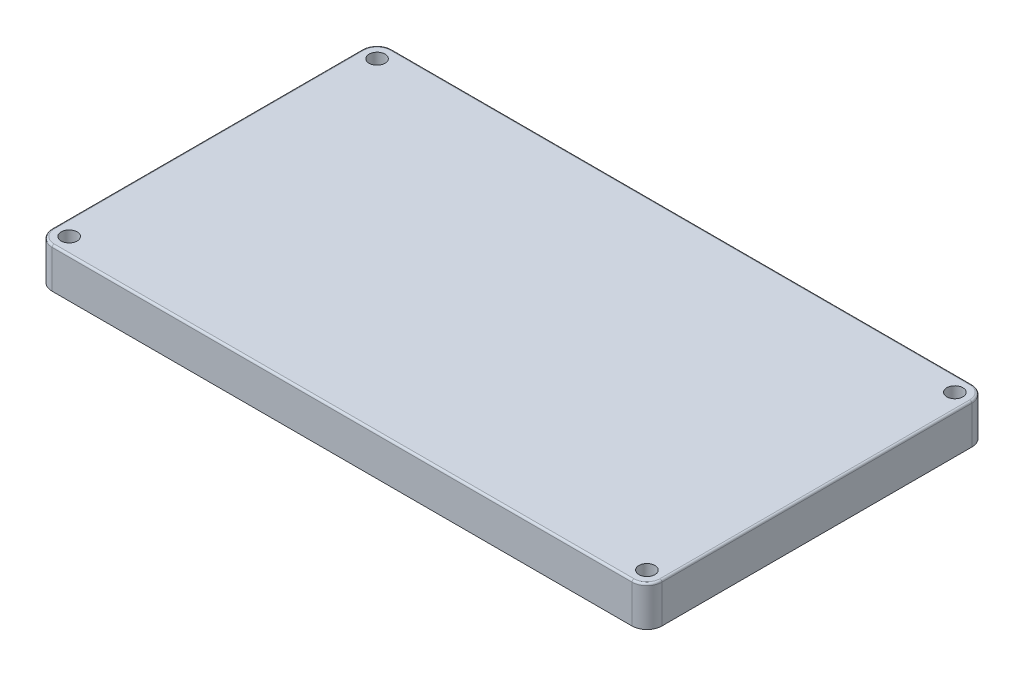
ISO-10303-21;
HEADER;
FILE_DESCRIPTION(('STEP AP214'),'2;1');
FILE_NAME('part.step','',(''),(''),'','','');
FILE_SCHEMA(('AUTOMOTIVE_DESIGN { 1 0 10303 214 1 1 1 1 }'));
ENDSEC;
DATA;
#1=APPLICATION_CONTEXT('core data for automotive mechanical design processes');
#2=APPLICATION_PROTOCOL_DEFINITION('international standard','automotive_design',2000,#1);
#3=PRODUCT_CONTEXT('',#1,'mechanical');
#4=PRODUCT('Part','Part','',(#3));
#5=PRODUCT_RELATED_PRODUCT_CATEGORY('part','',(#4));
#6=PRODUCT_DEFINITION_FORMATION('','',#4);
#7=PRODUCT_DEFINITION_CONTEXT('part definition',#1,'design');
#8=PRODUCT_DEFINITION('design','',#6,#7);
#9=PRODUCT_DEFINITION_SHAPE('','',#8);
#10=(LENGTH_UNIT() NAMED_UNIT(*) SI_UNIT(.MILLI.,.METRE.));
#11=(NAMED_UNIT(*) PLANE_ANGLE_UNIT() SI_UNIT($,.RADIAN.));
#12=(NAMED_UNIT(*) SI_UNIT($,.STERADIAN.) SOLID_ANGLE_UNIT());
#13=UNCERTAINTY_MEASURE_WITH_UNIT(LENGTH_MEASURE(1.E-05),#10,'distance_accuracy_value','');
#14=(GEOMETRIC_REPRESENTATION_CONTEXT(3) GLOBAL_UNCERTAINTY_ASSIGNED_CONTEXT((#13)) GLOBAL_UNIT_ASSIGNED_CONTEXT((#10,
#11,#12)) REPRESENTATION_CONTEXT('',''));
#15=CARTESIAN_POINT('',(0.,0.,0.));
#16=DIRECTION('',(0.,0.,1.));
#17=DIRECTION('',(1.,0.,0.));
#18=AXIS2_PLACEMENT_3D('',#15,#16,#17);
#19=CARTESIAN_POINT('',(152.77525855986,-63.5520685347959,-14.8438253126815));
#20=DIRECTION('',(0.,0.,-1.));
#21=DIRECTION('',(-1.,0.,0.));
#22=AXIS2_PLACEMENT_3D('',#19,#20,#21);
#23=CYLINDRICAL_SURFACE('',#22,1.);
#24=CARTESIAN_POINT('',(152.77525855986,-63.5520685347959,23.9061746873185));
#25=DIRECTION('',(0.,0.,-1.));
#26=DIRECTION('',(1.,0.,0.));
#27=AXIS2_PLACEMENT_3D('',#24,#25,#26);
#28=CIRCLE('',#27,1.);
#29=CARTESIAN_POINT('',(153.77525855986,-63.5520685347959,23.9061746873185));
#30=VERTEX_POINT('',#29);
#31=CARTESIAN_POINT('',(152.77525855986,-62.5520685347959,23.9061746873185));
#32=VERTEX_POINT('',#31);
#33=EDGE_CURVE('E240',#30,#32,#28,.F.);
#34=ORIENTED_EDGE('',*,*,#33,.F.);
#35=DIRECTION('',(0.,0.,-1.));
#36=VECTOR('',#35,1.);
#37=CARTESIAN_POINT('',(153.77525855986,-63.5520685347959,23.9061746873185));
#38=LINE('',#37,#36);
#39=CARTESIAN_POINT('',(153.77525855986,-63.5520685347959,-131.093825312682));
#40=VERTEX_POINT('',#39);
#41=EDGE_CURVE('E210',#40,#30,#38,.F.);
#42=ORIENTED_EDGE('',*,*,#41,.F.);
#43=CARTESIAN_POINT('',(152.77525855986,-63.5520685347959,-131.093825312682));
#44=DIRECTION('',(0.,0.,-1.));
#45=DIRECTION('',(1.,0.,0.));
#46=AXIS2_PLACEMENT_3D('',#43,#44,#45);
#47=CIRCLE('',#46,1.);
#48=CARTESIAN_POINT('',(152.77525855986,-62.5520685347959,-131.093825312682));
#49=VERTEX_POINT('',#48);
#50=EDGE_CURVE('E325',#49,#40,#47,.T.);
#51=ORIENTED_EDGE('',*,*,#50,.F.);
#52=DIRECTION('',(0.,0.,1.));
#53=VECTOR('',#52,1.);
#54=CARTESIAN_POINT('',(152.77525855986,-62.5520685347959,-53.5938253126815));
#55=LINE('',#54,#53);
#56=EDGE_CURVE('E224',#32,#49,#55,.F.);
#57=ORIENTED_EDGE('',*,*,#56,.F.);
#58=EDGE_LOOP('',(#34,#42,#51,#57));
#59=FACE_BOUND('',#58,.T.);
#60=ADVANCED_FACE('F17',(#59),#23,.T.);
#61=CARTESIAN_POINT('',(146.27525855986,-63.5520685347959,-131.093825312682));
#62=DIRECTION('',(0.,1.,0.));
#63=DIRECTION('',(0.,0.,1.));
#64=AXIS2_PLACEMENT_3D('',#61,#62,#63);
#65=TOROIDAL_SURFACE('',#64,6.50000000000001,1.);
#66=ORIENTED_EDGE('',*,*,#50,.T.);
#67=CARTESIAN_POINT('',(146.27525855986,-63.5520685347959,-131.093825312682));
#68=DIRECTION('',(0.,1.,0.));
#69=DIRECTION('',(0.,0.,1.));
#70=AXIS2_PLACEMENT_3D('',#67,#68,#69);
#71=CIRCLE('',#70,7.5);
#72=CARTESIAN_POINT('',(146.27525855986,-63.5520685347959,-138.593825312682));
#73=VERTEX_POINT('',#72);
#74=EDGE_CURVE('E143',#73,#40,#71,.F.);
#75=ORIENTED_EDGE('',*,*,#74,.F.);
#76=CARTESIAN_POINT('',(146.27525855986,-63.5520685347959,-137.593825312682));
#77=DIRECTION('',(-1.,0.,0.));
#78=DIRECTION('',(0.,0.,1.));
#79=AXIS2_PLACEMENT_3D('',#76,#77,#78);
#80=CIRCLE('',#79,1.);
#81=CARTESIAN_POINT('',(146.27525855986,-62.5520685347959,-137.593825312682));
#82=VERTEX_POINT('',#81);
#83=EDGE_CURVE('E317',#82,#73,#80,.T.);
#84=ORIENTED_EDGE('',*,*,#83,.F.);
#85=CARTESIAN_POINT('',(146.27525855986,-62.5520685347959,-131.093825312682));
#86=DIRECTION('',(0.,-1.,0.));
#87=DIRECTION('',(0.,0.,-1.));
#88=AXIS2_PLACEMENT_3D('',#85,#86,#87);
#89=CIRCLE('',#88,6.50000000000001);
#90=EDGE_CURVE('E221',#49,#82,#89,.F.);
#91=ORIENTED_EDGE('',*,*,#90,.F.);
#92=EDGE_LOOP('',(#66,#75,#84,#91));
#93=FACE_BOUND('',#92,.T.);
#94=ADVANCED_FACE('F330',(#93),#65,.T.);
#95=CARTESIAN_POINT('',(73.7752585598595,-63.5520685347959,-137.593825312682));
#96=DIRECTION('',(-1.,0.,0.));
#97=DIRECTION('',(0.,0.,1.));
#98=AXIS2_PLACEMENT_3D('',#95,#96,#97);
#99=CYLINDRICAL_SURFACE('',#98,1.);
#100=ORIENTED_EDGE('',*,*,#83,.T.);
#101=DIRECTION('',(-1.,0.,0.));
#102=VECTOR('',#101,1.);
#103=CARTESIAN_POINT('',(146.27525855986,-63.5520685347959,-138.593825312682));
#104=LINE('',#103,#102);
#105=CARTESIAN_POINT('',(-143.72474144014,-63.5520685347959,-138.593825312682));
#106=VERTEX_POINT('',#105);
#107=EDGE_CURVE('E75',#106,#73,#104,.F.);
#108=ORIENTED_EDGE('',*,*,#107,.F.);
#109=CARTESIAN_POINT('',(-143.72474144014,-63.5520685347959,-137.593825312682));
#110=DIRECTION('',(-1.,0.,0.));
#111=DIRECTION('',(0.,0.,-1.));
#112=AXIS2_PLACEMENT_3D('',#109,#110,#111);
#113=CIRCLE('',#112,1.);
#114=CARTESIAN_POINT('',(-143.72474144014,-62.5520685347959,-137.593825312682));
#115=VERTEX_POINT('',#114);
#116=EDGE_CURVE('E314',#115,#106,#113,.T.);
#117=ORIENTED_EDGE('',*,*,#116,.F.);
#118=DIRECTION('',(1.,0.,0.));
#119=VECTOR('',#118,1.);
#120=CARTESIAN_POINT('',(1.27525855985953,-62.5520685347959,-137.593825312682));
#121=LINE('',#120,#119);
#122=EDGE_CURVE('E218',#82,#115,#121,.F.);
#123=ORIENTED_EDGE('',*,*,#122,.F.);
#124=EDGE_LOOP('',(#100,#108,#117,#123));
#125=FACE_BOUND('',#124,.T.);
#126=ADVANCED_FACE('F308',(#125),#99,.T.);
#127=CARTESIAN_POINT('',(-143.72474144014,-63.5520685347959,-131.093825312682));
#128=DIRECTION('',(0.,1.,0.));
#129=DIRECTION('',(0.,0.,1.));
#130=AXIS2_PLACEMENT_3D('',#127,#128,#129);
#131=TOROIDAL_SURFACE('',#130,6.50000000000001,1.);
#132=ORIENTED_EDGE('',*,*,#116,.T.);
#133=CARTESIAN_POINT('',(-143.72474144014,-63.5520685347959,-131.093825312682));
#134=DIRECTION('',(0.,1.,0.));
#135=DIRECTION('',(0.,0.,1.));
#136=AXIS2_PLACEMENT_3D('',#133,#134,#135);
#137=CIRCLE('',#136,7.5);
#138=CARTESIAN_POINT('',(-151.22474144014,-63.5520685347959,-131.093825312682));
#139=VERTEX_POINT('',#138);
#140=EDGE_CURVE('E77',#139,#106,#137,.F.);
#141=ORIENTED_EDGE('',*,*,#140,.F.);
#142=CARTESIAN_POINT('',(-150.22474144014,-63.5520685347959,-131.093825312682));
#143=DIRECTION('',(0.,0.,1.));
#144=DIRECTION('',(1.,0.,0.));
#145=AXIS2_PLACEMENT_3D('',#142,#143,#144);
#146=CIRCLE('',#145,1.);
#147=CARTESIAN_POINT('',(-150.22474144014,-62.5520685347959,-131.093825312682));
#148=VERTEX_POINT('',#147);
#149=EDGE_CURVE('E316',#148,#139,#146,.T.);
#150=ORIENTED_EDGE('',*,*,#149,.F.);
#151=CARTESIAN_POINT('',(-143.72474144014,-62.5520685347959,-131.093825312682));
#152=DIRECTION('',(0.,-1.,0.));
#153=DIRECTION('',(-1.,0.,0.));
#154=AXIS2_PLACEMENT_3D('',#151,#152,#153);
#155=CIRCLE('',#154,6.50000000000001);
#156=EDGE_CURVE('E215',#115,#148,#155,.F.);
#157=ORIENTED_EDGE('',*,*,#156,.F.);
#158=EDGE_LOOP('',(#132,#141,#150,#157));
#159=FACE_BOUND('',#158,.T.);
#160=ADVANCED_FACE('F298',(#159),#131,.T.);
#161=CARTESIAN_POINT('',(-150.22474144014,-63.5520685347959,-92.3438253126815));
#162=DIRECTION('',(0.,0.,1.));
#163=DIRECTION('',(1.,0.,0.));
#164=AXIS2_PLACEMENT_3D('',#161,#162,#163);
#165=CYLINDRICAL_SURFACE('',#164,1.);
#166=ORIENTED_EDGE('',*,*,#149,.T.);
#167=DIRECTION('',(0.,0.,1.));
#168=VECTOR('',#167,1.);
#169=CARTESIAN_POINT('',(-151.22474144014,-63.5520685347959,-131.093825312682));
#170=LINE('',#169,#168);
#171=CARTESIAN_POINT('',(-151.22474144014,-63.5520685347959,23.9061746873185));
#172=VERTEX_POINT('',#171);
#173=EDGE_CURVE('E133',#172,#139,#170,.F.);
#174=ORIENTED_EDGE('',*,*,#173,.F.);
#175=CARTESIAN_POINT('',(-150.22474144014,-63.5520685347959,23.9061746873185));
#176=DIRECTION('',(0.,0.,1.));
#177=DIRECTION('',(-1.,0.,0.));
#178=AXIS2_PLACEMENT_3D('',#175,#176,#177);
#179=CIRCLE('',#178,1.);
#180=CARTESIAN_POINT('',(-150.22474144014,-62.5520685347959,23.9061746873185));
#181=VERTEX_POINT('',#180);
#182=EDGE_CURVE('E257',#181,#172,#179,.T.);
#183=ORIENTED_EDGE('',*,*,#182,.F.);
#184=DIRECTION('',(0.,0.,1.));
#185=VECTOR('',#184,1.);
#186=CARTESIAN_POINT('',(-150.22474144014,-62.5520685347959,-53.5938253126815));
#187=LINE('',#186,#185);
#188=EDGE_CURVE('E213',#148,#181,#187,.T.);
#189=ORIENTED_EDGE('',*,*,#188,.F.);
#190=EDGE_LOOP('',(#166,#174,#183,#189));
#191=FACE_BOUND('',#190,.T.);
#192=ADVANCED_FACE('F273',(#191),#165,.T.);
#193=CARTESIAN_POINT('',(-143.72474144014,-63.5520685347959,23.9061746873185));
#194=DIRECTION('',(0.,1.,0.));
#195=DIRECTION('',(0.,0.,1.));
#196=AXIS2_PLACEMENT_3D('',#193,#194,#195);
#197=TOROIDAL_SURFACE('',#196,6.5,1.);
#198=ORIENTED_EDGE('',*,*,#182,.T.);
#199=CARTESIAN_POINT('',(-143.72474144014,-63.5520685347959,23.9061746873185));
#200=DIRECTION('',(0.,1.,0.));
#201=DIRECTION('',(0.,0.,1.));
#202=AXIS2_PLACEMENT_3D('',#199,#200,#201);
#203=CIRCLE('',#202,7.5);
#204=CARTESIAN_POINT('',(-143.72474144014,-63.5520685347959,31.4061746873185));
#205=VERTEX_POINT('',#204);
#206=EDGE_CURVE('E128',#205,#172,#203,.F.);
#207=ORIENTED_EDGE('',*,*,#206,.F.);
#208=CARTESIAN_POINT('',(-143.72474144014,-63.5520685347959,30.4061746873185));
#209=DIRECTION('',(1.,0.,0.));
#210=DIRECTION('',(0.,0.,-1.));
#211=AXIS2_PLACEMENT_3D('',#208,#209,#210);
#212=CIRCLE('',#211,1.);
#213=CARTESIAN_POINT('',(-143.72474144014,-62.5520685347959,30.4061746873185));
#214=VERTEX_POINT('',#213);
#215=EDGE_CURVE('E248',#214,#205,#212,.T.);
#216=ORIENTED_EDGE('',*,*,#215,.F.);
#217=CARTESIAN_POINT('',(-143.72474144014,-62.5520685347959,23.9061746873185));
#218=DIRECTION('',(0.,-1.,0.));
#219=DIRECTION('',(0.,0.,1.));
#220=AXIS2_PLACEMENT_3D('',#217,#218,#219);
#221=CIRCLE('',#220,6.5);
#222=EDGE_CURVE('E198',#181,#214,#221,.F.);
#223=ORIENTED_EDGE('',*,*,#222,.F.);
#224=EDGE_LOOP('',(#198,#207,#216,#223));
#225=FACE_BOUND('',#224,.T.);
#226=ADVANCED_FACE('F268',(#225),#197,.T.);
#227=CARTESIAN_POINT('',(-71.2247414401405,-63.5520685347959,30.4061746873185));
#228=DIRECTION('',(1.,0.,0.));
#229=DIRECTION('',(0.,0.,-1.));
#230=AXIS2_PLACEMENT_3D('',#227,#228,#229);
#231=CYLINDRICAL_SURFACE('',#230,1.);
#232=ORIENTED_EDGE('',*,*,#215,.T.);
#233=DIRECTION('',(1.,0.,0.));
#234=VECTOR('',#233,1.);
#235=CARTESIAN_POINT('',(-143.72474144014,-63.5520685347959,31.4061746873185));
#236=LINE('',#235,#234);
#237=CARTESIAN_POINT('',(146.27525855986,-63.5520685347959,31.4061746873185));
#238=VERTEX_POINT('',#237);
#239=EDGE_CURVE('E123',#238,#205,#236,.F.);
#240=ORIENTED_EDGE('',*,*,#239,.F.);
#241=CARTESIAN_POINT('',(146.27525855986,-63.5520685347959,30.4061746873185));
#242=DIRECTION('',(1.,0.,0.));
#243=DIRECTION('',(0.,0.,1.));
#244=AXIS2_PLACEMENT_3D('',#241,#242,#243);
#245=CIRCLE('',#244,1.);
#246=CARTESIAN_POINT('',(146.27525855986,-62.5520685347959,30.4061746873185));
#247=VERTEX_POINT('',#246);
#248=EDGE_CURVE('E243',#247,#238,#245,.T.);
#249=ORIENTED_EDGE('',*,*,#248,.F.);
#250=DIRECTION('',(1.,0.,0.));
#251=VECTOR('',#250,1.);
#252=CARTESIAN_POINT('',(1.27525855985953,-62.5520685347959,30.4061746873185));
#253=LINE('',#252,#251);
#254=EDGE_CURVE('E203',#214,#247,#253,.T.);
#255=ORIENTED_EDGE('',*,*,#254,.F.);
#256=EDGE_LOOP('',(#232,#240,#249,#255));
#257=FACE_BOUND('',#256,.T.);
#258=ADVANCED_FACE('F272',(#257),#231,.T.);
#259=CARTESIAN_POINT('',(146.27525855986,-63.5520685347959,23.9061746873185));
#260=DIRECTION('',(0.,1.,0.));
#261=DIRECTION('',(0.,0.,1.));
#262=AXIS2_PLACEMENT_3D('',#259,#260,#261);
#263=TOROIDAL_SURFACE('',#262,6.5,1.);
#264=ORIENTED_EDGE('',*,*,#33,.T.);
#265=CARTESIAN_POINT('',(146.27525855986,-62.5520685347959,23.9061746873185));
#266=DIRECTION('',(0.,-1.,0.));
#267=DIRECTION('',(1.,0.,0.));
#268=AXIS2_PLACEMENT_3D('',#265,#266,#267);
#269=CIRCLE('',#268,6.49999999999998);
#270=EDGE_CURVE('E153',#247,#32,#269,.F.);
#271=ORIENTED_EDGE('',*,*,#270,.F.);
#272=ORIENTED_EDGE('',*,*,#248,.T.);
#273=CARTESIAN_POINT('',(146.27525855986,-63.5520685347959,23.9061746873185));
#274=DIRECTION('',(0.,1.,0.));
#275=DIRECTION('',(0.,0.,1.));
#276=AXIS2_PLACEMENT_3D('',#273,#274,#275);
#277=CIRCLE('',#276,7.5);
#278=EDGE_CURVE('E114',#30,#238,#277,.F.);
#279=ORIENTED_EDGE('',*,*,#278,.F.);
#280=EDGE_LOOP('',(#264,#271,#272,#279));
#281=FACE_BOUND('',#280,.T.);
#282=ADVANCED_FACE('F172',(#281),#263,.T.);
#283=CARTESIAN_POINT('',(1.27525855985953,-62.5520685347959,-53.5938253126815));
#284=DIRECTION('',(0.,1.,0.));
#285=DIRECTION('',(0.,0.,1.));
#286=AXIS2_PLACEMENT_3D('',#283,#284,#285);
#287=PLANE('',#286);
#288=CARTESIAN_POINT('',(-143.22474144014,-62.5520685347959,23.4061746873184));
#289=DIRECTION('',(0.,-1.,0.));
#290=DIRECTION('',(0.,0.,-1.));
#291=AXIS2_PLACEMENT_3D('',#288,#289,#290);
#292=CIRCLE('',#291,4.);
#293=CARTESIAN_POINT('',(-143.22474144014,-62.5520685347959,19.4061746873184));
#294=VERTEX_POINT('',#293);
#295=EDGE_CURVE('E20',#294,#294,#292,.T.);
#296=ORIENTED_EDGE('',*,*,#295,.T.);
#297=EDGE_LOOP('',(#296));
#298=FACE_BOUND('',#297,.T.);
#299=CARTESIAN_POINT('',(145.77525855986,-62.5520685347959,23.4061746873184));
#300=DIRECTION('',(0.,-1.,0.));
#301=DIRECTION('',(0.,0.,-1.));
#302=AXIS2_PLACEMENT_3D('',#299,#300,#301);
#303=CIRCLE('',#302,4.);
#304=CARTESIAN_POINT('',(145.77525855986,-62.5520685347959,19.4061746873184));
#305=VERTEX_POINT('',#304);
#306=EDGE_CURVE('E101',#305,#305,#303,.T.);
#307=ORIENTED_EDGE('',*,*,#306,.T.);
#308=EDGE_LOOP('',(#307));
#309=FACE_BOUND('',#308,.T.);
#310=CARTESIAN_POINT('',(-143.22474144014,-62.5520685347959,-130.593825312682));
#311=DIRECTION('',(0.,-1.,0.));
#312=DIRECTION('',(0.,0.,-1.));
#313=AXIS2_PLACEMENT_3D('',#310,#311,#312);
#314=CIRCLE('',#313,4.);
#315=CARTESIAN_POINT('',(-143.22474144014,-62.5520685347959,-134.593825312682));
#316=VERTEX_POINT('',#315);
#317=EDGE_CURVE('E99',#316,#316,#314,.T.);
#318=ORIENTED_EDGE('',*,*,#317,.T.);
#319=EDGE_LOOP('',(#318));
#320=FACE_BOUND('',#319,.T.);
#321=CARTESIAN_POINT('',(145.77525855986,-62.5520685347959,-130.593825312682));
#322=DIRECTION('',(0.,-1.,0.));
#323=DIRECTION('',(0.,0.,-1.));
#324=AXIS2_PLACEMENT_3D('',#321,#322,#323);
#325=CIRCLE('',#324,4.);
#326=CARTESIAN_POINT('',(145.77525855986,-62.5520685347959,-134.593825312682));
#327=VERTEX_POINT('',#326);
#328=EDGE_CURVE('E92',#327,#327,#325,.T.);
#329=ORIENTED_EDGE('',*,*,#328,.T.);
#330=EDGE_LOOP('',(#329));
#331=FACE_BOUND('',#330,.T.);
#332=ORIENTED_EDGE('',*,*,#222,.T.);
#333=ORIENTED_EDGE('',*,*,#254,.T.);
#334=ORIENTED_EDGE('',*,*,#270,.T.);
#335=ORIENTED_EDGE('',*,*,#56,.T.);
#336=ORIENTED_EDGE('',*,*,#90,.T.);
#337=ORIENTED_EDGE('',*,*,#122,.T.);
#338=ORIENTED_EDGE('',*,*,#156,.T.);
#339=ORIENTED_EDGE('',*,*,#188,.T.);
#340=EDGE_LOOP('',(#332,#333,#334,#335,#336,#337,#338,#339));
#341=FACE_BOUND('',#340,.T.);
#342=ADVANCED_FACE('F161',(#298,#309,#320,#331,#341),#287,.T.);
#343=CARTESIAN_POINT('',(153.77525855986,-82.5520685347959,23.9061746873185));
#344=DIRECTION('',(1.,0.,0.));
#345=DIRECTION('',(0.,0.,-1.));
#346=AXIS2_PLACEMENT_3D('',#343,#344,#345);
#347=PLANE('',#346);
#348=DIRECTION('',(0.,0.,1.));
#349=VECTOR('',#348,1.);
#350=CARTESIAN_POINT('',(153.77525855986,-82.5520685347959,-53.5938253126815));
#351=LINE('',#350,#349);
#352=CARTESIAN_POINT('',(153.77525855986,-82.5520685347959,23.9061746873185));
#353=VERTEX_POINT('',#352);
#354=CARTESIAN_POINT('',(153.77525855986,-82.5520685347959,-131.093825312682));
#355=VERTEX_POINT('',#354);
#356=EDGE_CURVE('E90',#353,#355,#351,.F.);
#357=ORIENTED_EDGE('',*,*,#356,.T.);
#358=DIRECTION('',(0.,1.,0.));
#359=VECTOR('',#358,1.);
#360=CARTESIAN_POINT('',(153.77525855986,-82.5520685347959,-131.093825312682));
#361=LINE('',#360,#359);
#362=EDGE_CURVE('E61',#40,#355,#361,.F.);
#363=ORIENTED_EDGE('',*,*,#362,.F.);
#364=ORIENTED_EDGE('',*,*,#41,.T.);
#365=DIRECTION('',(0.,1.,0.));
#366=VECTOR('',#365,1.);
#367=CARTESIAN_POINT('',(153.77525855986,-82.5520685347959,23.9061746873185));
#368=LINE('',#367,#366);
#369=EDGE_CURVE('E106',#353,#30,#368,.T.);
#370=ORIENTED_EDGE('',*,*,#369,.F.);
#371=EDGE_LOOP('',(#357,#363,#364,#370));
#372=FACE_BOUND('',#371,.T.);
#373=ADVANCED_FACE('F171',(#372),#347,.T.);
#374=CARTESIAN_POINT('',(146.27525855986,-82.5520685347959,-131.093825312682));
#375=DIRECTION('',(0.,1.,0.));
#376=DIRECTION('',(0.,0.,1.));
#377=AXIS2_PLACEMENT_3D('',#374,#375,#376);
#378=CYLINDRICAL_SURFACE('',#377,7.5);
#379=CARTESIAN_POINT('',(146.27525855986,-82.5520685347959,-131.093825312682));
#380=DIRECTION('',(0.,1.,0.));
#381=DIRECTION('',(0.,0.,1.));
#382=AXIS2_PLACEMENT_3D('',#379,#380,#381);
#383=CIRCLE('',#382,7.5);
#384=CARTESIAN_POINT('',(146.27525855986,-82.5520685347959,-138.593825312682));
#385=VERTEX_POINT('',#384);
#386=EDGE_CURVE('E83',#355,#385,#383,.T.);
#387=ORIENTED_EDGE('',*,*,#386,.T.);
#388=DIRECTION('',(0.,1.,0.));
#389=VECTOR('',#388,1.);
#390=CARTESIAN_POINT('',(146.27525855986,-82.5520685347959,-138.593825312682));
#391=LINE('',#390,#389);
#392=EDGE_CURVE('E68',#73,#385,#391,.F.);
#393=ORIENTED_EDGE('',*,*,#392,.F.);
#394=ORIENTED_EDGE('',*,*,#74,.T.);
#395=ORIENTED_EDGE('',*,*,#362,.T.);
#396=EDGE_LOOP('',(#387,#393,#394,#395));
#397=FACE_BOUND('',#396,.T.);
#398=ADVANCED_FACE('F89',(#397),#378,.T.);
#399=CARTESIAN_POINT('',(146.27525855986,-82.5520685347959,-138.593825312682));
#400=DIRECTION('',(0.,0.,-1.));
#401=DIRECTION('',(-1.,0.,0.));
#402=AXIS2_PLACEMENT_3D('',#399,#400,#401);
#403=PLANE('',#402);
#404=DIRECTION('',(1.,0.,0.));
#405=VECTOR('',#404,1.);
#406=CARTESIAN_POINT('',(1.27525855985953,-82.5520685347959,-138.593825312682));
#407=LINE('',#406,#405);
#408=CARTESIAN_POINT('',(-143.72474144014,-82.5520685347959,-138.593825312682));
#409=VERTEX_POINT('',#408);
#410=EDGE_CURVE('E72',#385,#409,#407,.F.);
#411=ORIENTED_EDGE('',*,*,#410,.T.);
#412=DIRECTION('',(0.,1.,0.));
#413=VECTOR('',#412,1.);
#414=CARTESIAN_POINT('',(-143.72474144014,-82.5520685347959,-138.593825312682));
#415=LINE('',#414,#413);
#416=EDGE_CURVE('E136',#106,#409,#415,.F.);
#417=ORIENTED_EDGE('',*,*,#416,.F.);
#418=ORIENTED_EDGE('',*,*,#107,.T.);
#419=ORIENTED_EDGE('',*,*,#392,.T.);
#420=EDGE_LOOP('',(#411,#417,#418,#419));
#421=FACE_BOUND('',#420,.T.);
#422=ADVANCED_FACE('F70',(#421),#403,.T.);
#423=CARTESIAN_POINT('',(-143.72474144014,-82.5520685347959,-131.093825312682));
#424=DIRECTION('',(0.,1.,0.));
#425=DIRECTION('',(0.,0.,1.));
#426=AXIS2_PLACEMENT_3D('',#423,#424,#425);
#427=CYLINDRICAL_SURFACE('',#426,7.5);
#428=CARTESIAN_POINT('',(-143.72474144014,-82.5520685347959,-131.093825312682));
#429=DIRECTION('',(0.,1.,0.));
#430=DIRECTION('',(0.,0.,1.));
#431=AXIS2_PLACEMENT_3D('',#428,#429,#430);
#432=CIRCLE('',#431,7.5);
#433=CARTESIAN_POINT('',(-151.22474144014,-82.5520685347959,-131.093825312682));
#434=VERTEX_POINT('',#433);
#435=EDGE_CURVE('E87',#409,#434,#432,.T.);
#436=ORIENTED_EDGE('',*,*,#435,.T.);
#437=DIRECTION('',(0.,1.,0.));
#438=VECTOR('',#437,1.);
#439=CARTESIAN_POINT('',(-151.22474144014,-82.5520685347959,-131.093825312682));
#440=LINE('',#439,#438);
#441=EDGE_CURVE('E131',#139,#434,#440,.F.);
#442=ORIENTED_EDGE('',*,*,#441,.F.);
#443=ORIENTED_EDGE('',*,*,#140,.T.);
#444=ORIENTED_EDGE('',*,*,#416,.T.);
#445=EDGE_LOOP('',(#436,#442,#443,#444));
#446=FACE_BOUND('',#445,.T.);
#447=ADVANCED_FACE('F377',(#446),#427,.T.);
#448=CARTESIAN_POINT('',(-151.22474144014,-82.5520685347959,-131.093825312682));
#449=DIRECTION('',(-1.,0.,0.));
#450=DIRECTION('',(0.,0.,1.));
#451=AXIS2_PLACEMENT_3D('',#448,#449,#450);
#452=PLANE('',#451);
#453=DIRECTION('',(0.,0.,1.));
#454=VECTOR('',#453,1.);
#455=CARTESIAN_POINT('',(-151.22474144014,-82.5520685347959,-53.5938253126815));
#456=LINE('',#455,#454);
#457=CARTESIAN_POINT('',(-151.22474144014,-82.5520685347959,23.9061746873185));
#458=VERTEX_POINT('',#457);
#459=EDGE_CURVE('E365',#434,#458,#456,.T.);
#460=ORIENTED_EDGE('',*,*,#459,.T.);
#461=DIRECTION('',(0.,1.,0.));
#462=VECTOR('',#461,1.);
#463=CARTESIAN_POINT('',(-151.22474144014,-82.5520685347959,23.9061746873185));
#464=LINE('',#463,#462);
#465=EDGE_CURVE('E126',#172,#458,#464,.F.);
#466=ORIENTED_EDGE('',*,*,#465,.F.);
#467=ORIENTED_EDGE('',*,*,#173,.T.);
#468=ORIENTED_EDGE('',*,*,#441,.T.);
#469=EDGE_LOOP('',(#460,#466,#467,#468));
#470=FACE_BOUND('',#469,.T.);
#471=ADVANCED_FACE('F463',(#470),#452,.T.);
#472=CARTESIAN_POINT('',(-143.72474144014,-82.5520685347959,23.9061746873185));
#473=DIRECTION('',(0.,1.,0.));
#474=DIRECTION('',(0.,0.,1.));
#475=AXIS2_PLACEMENT_3D('',#472,#473,#474);
#476=CYLINDRICAL_SURFACE('',#475,7.5);
#477=CARTESIAN_POINT('',(-143.72474144014,-82.5520685347959,23.9061746873185));
#478=DIRECTION('',(0.,1.,0.));
#479=DIRECTION('',(0.,0.,1.));
#480=AXIS2_PLACEMENT_3D('',#477,#478,#479);
#481=CIRCLE('',#480,7.5);
#482=CARTESIAN_POINT('',(-143.72474144014,-82.5520685347959,31.4061746873185));
#483=VERTEX_POINT('',#482);
#484=EDGE_CURVE('E363',#458,#483,#481,.T.);
#485=ORIENTED_EDGE('',*,*,#484,.T.);
#486=DIRECTION('',(0.,1.,0.));
#487=VECTOR('',#486,1.);
#488=CARTESIAN_POINT('',(-143.72474144014,-82.5520685347959,31.4061746873185));
#489=LINE('',#488,#487);
#490=EDGE_CURVE('E121',#205,#483,#489,.F.);
#491=ORIENTED_EDGE('',*,*,#490,.F.);
#492=ORIENTED_EDGE('',*,*,#206,.T.);
#493=ORIENTED_EDGE('',*,*,#465,.T.);
#494=EDGE_LOOP('',(#485,#491,#492,#493));
#495=FACE_BOUND('',#494,.T.);
#496=ADVANCED_FACE('F459',(#495),#476,.T.);
#497=CARTESIAN_POINT('',(-143.72474144014,-82.5520685347959,31.4061746873185));
#498=DIRECTION('',(0.,0.,1.));
#499=DIRECTION('',(1.,0.,0.));
#500=AXIS2_PLACEMENT_3D('',#497,#498,#499);
#501=PLANE('',#500);
#502=DIRECTION('',(1.,0.,0.));
#503=VECTOR('',#502,1.);
#504=CARTESIAN_POINT('',(1.27525855985953,-82.5520685347959,31.4061746873185));
#505=LINE('',#504,#503);
#506=CARTESIAN_POINT('',(146.27525855986,-82.5520685347959,31.4061746873185));
#507=VERTEX_POINT('',#506);
#508=EDGE_CURVE('E362',#483,#507,#505,.T.);
#509=ORIENTED_EDGE('',*,*,#508,.T.);
#510=DIRECTION('',(0.,1.,0.));
#511=VECTOR('',#510,1.);
#512=CARTESIAN_POINT('',(146.27525855986,-82.5520685347959,31.4061746873185));
#513=LINE('',#512,#511);
#514=EDGE_CURVE('E35',#238,#507,#513,.F.);
#515=ORIENTED_EDGE('',*,*,#514,.F.);
#516=ORIENTED_EDGE('',*,*,#239,.T.);
#517=ORIENTED_EDGE('',*,*,#490,.T.);
#518=EDGE_LOOP('',(#509,#515,#516,#517));
#519=FACE_BOUND('',#518,.T.);
#520=ADVANCED_FACE('F456',(#519),#501,.T.);
#521=CARTESIAN_POINT('',(146.27525855986,-82.5520685347959,23.9061746873185));
#522=DIRECTION('',(0.,1.,0.));
#523=DIRECTION('',(0.,0.,1.));
#524=AXIS2_PLACEMENT_3D('',#521,#522,#523);
#525=CYLINDRICAL_SURFACE('',#524,7.5);
#526=CARTESIAN_POINT('',(146.27525855986,-82.5520685347959,23.9061746873185));
#527=DIRECTION('',(0.,1.,0.));
#528=DIRECTION('',(0.,0.,1.));
#529=AXIS2_PLACEMENT_3D('',#526,#527,#528);
#530=CIRCLE('',#529,7.5);
#531=EDGE_CURVE('E361',#507,#353,#530,.T.);
#532=ORIENTED_EDGE('',*,*,#531,.T.);
#533=ORIENTED_EDGE('',*,*,#369,.T.);
#534=ORIENTED_EDGE('',*,*,#278,.T.);
#535=ORIENTED_EDGE('',*,*,#514,.T.);
#536=EDGE_LOOP('',(#532,#533,#534,#535));
#537=FACE_BOUND('',#536,.T.);
#538=ADVANCED_FACE('F452',(#537),#525,.T.);
#539=CARTESIAN_POINT('',(-143.22474144014,-62.5520685347959,23.4061746873184));
#540=DIRECTION('',(0.,-1.,0.));
#541=DIRECTION('',(0.,0.,-1.));
#542=AXIS2_PLACEMENT_3D('',#539,#540,#541);
#543=CYLINDRICAL_SURFACE('',#542,4.);
#544=CARTESIAN_POINT('',(-143.22474144014,-82.5520685347959,23.4061746873184));
#545=DIRECTION('',(0.,-1.,0.));
#546=DIRECTION('',(0.,0.,-1.));
#547=AXIS2_PLACEMENT_3D('',#544,#545,#546);
#548=CIRCLE('',#547,4.);
#549=CARTESIAN_POINT('',(-143.22474144014,-82.5520685347959,19.4061746873184));
#550=VERTEX_POINT('',#549);
#551=EDGE_CURVE('E358',#550,#550,#548,.T.);
#552=ORIENTED_EDGE('',*,*,#551,.T.);
#553=EDGE_LOOP('',(#552));
#554=FACE_BOUND('',#553,.T.);
#555=ORIENTED_EDGE('',*,*,#295,.F.);
#556=EDGE_LOOP('',(#555));
#557=FACE_BOUND('',#556,.T.);
#558=ADVANCED_FACE('F448',(#554,#557),#543,.F.);
#559=CARTESIAN_POINT('',(145.77525855986,-62.5520685347959,23.4061746873184));
#560=DIRECTION('',(0.,-1.,0.));
#561=DIRECTION('',(0.,0.,-1.));
#562=AXIS2_PLACEMENT_3D('',#559,#560,#561);
#563=CYLINDRICAL_SURFACE('',#562,4.);
#564=CARTESIAN_POINT('',(145.77525855986,-82.5520685347959,23.4061746873184));
#565=DIRECTION('',(0.,-1.,0.));
#566=DIRECTION('',(0.,0.,-1.));
#567=AXIS2_PLACEMENT_3D('',#564,#565,#566);
#568=CIRCLE('',#567,4.);
#569=CARTESIAN_POINT('',(145.77525855986,-82.5520685347959,19.4061746873184));
#570=VERTEX_POINT('',#569);
#571=EDGE_CURVE('E355',#570,#570,#568,.T.);
#572=ORIENTED_EDGE('',*,*,#571,.T.);
#573=EDGE_LOOP('',(#572));
#574=FACE_BOUND('',#573,.T.);
#575=ORIENTED_EDGE('',*,*,#306,.F.);
#576=EDGE_LOOP('',(#575));
#577=FACE_BOUND('',#576,.T.);
#578=ADVANCED_FACE('F444',(#574,#577),#563,.F.);
#579=CARTESIAN_POINT('',(-143.22474144014,-62.5520685347959,-130.593825312682));
#580=DIRECTION('',(0.,-1.,0.));
#581=DIRECTION('',(0.,0.,-1.));
#582=AXIS2_PLACEMENT_3D('',#579,#580,#581);
#583=CYLINDRICAL_SURFACE('',#582,4.);
#584=CARTESIAN_POINT('',(-143.22474144014,-82.5520685347959,-130.593825312682));
#585=DIRECTION('',(0.,-1.,0.));
#586=DIRECTION('',(0.,0.,-1.));
#587=AXIS2_PLACEMENT_3D('',#584,#585,#586);
#588=CIRCLE('',#587,4.);
#589=CARTESIAN_POINT('',(-143.22474144014,-82.5520685347959,-134.593825312682));
#590=VERTEX_POINT('',#589);
#591=EDGE_CURVE('E26',#590,#590,#588,.T.);
#592=ORIENTED_EDGE('',*,*,#591,.T.);
#593=EDGE_LOOP('',(#592));
#594=FACE_BOUND('',#593,.T.);
#595=ORIENTED_EDGE('',*,*,#317,.F.);
#596=EDGE_LOOP('',(#595));
#597=FACE_BOUND('',#596,.T.);
#598=ADVANCED_FACE('F436',(#594,#597),#583,.F.);
#599=CARTESIAN_POINT('',(145.77525855986,-62.5520685347959,-130.593825312682));
#600=DIRECTION('',(0.,-1.,0.));
#601=DIRECTION('',(0.,0.,-1.));
#602=AXIS2_PLACEMENT_3D('',#599,#600,#601);
#603=CYLINDRICAL_SURFACE('',#602,4.);
#604=CARTESIAN_POINT('',(145.77525855986,-82.5520685347959,-130.593825312682));
#605=DIRECTION('',(0.,-1.,0.));
#606=DIRECTION('',(0.,0.,-1.));
#607=AXIS2_PLACEMENT_3D('',#604,#605,#606);
#608=CIRCLE('',#607,4.);
#609=CARTESIAN_POINT('',(145.77525855986,-82.5520685347959,-134.593825312682));
#610=VERTEX_POINT('',#609);
#611=EDGE_CURVE('E11',#610,#610,#608,.T.);
#612=ORIENTED_EDGE('',*,*,#611,.T.);
#613=EDGE_LOOP('',(#612));
#614=FACE_BOUND('',#613,.T.);
#615=ORIENTED_EDGE('',*,*,#328,.F.);
#616=EDGE_LOOP('',(#615));
#617=FACE_BOUND('',#616,.T.);
#618=ADVANCED_FACE('F430',(#614,#617),#603,.F.);
#619=CARTESIAN_POINT('',(1.27525855985953,-82.5520685347959,-53.5938253126815));
#620=DIRECTION('',(0.,1.,0.));
#621=DIRECTION('',(0.,0.,1.));
#622=AXIS2_PLACEMENT_3D('',#619,#620,#621);
#623=PLANE('',#622);
#624=ORIENTED_EDGE('',*,*,#611,.F.);
#625=EDGE_LOOP('',(#624));
#626=FACE_BOUND('',#625,.T.);
#627=ORIENTED_EDGE('',*,*,#591,.F.);
#628=EDGE_LOOP('',(#627));
#629=FACE_BOUND('',#628,.T.);
#630=ORIENTED_EDGE('',*,*,#571,.F.);
#631=EDGE_LOOP('',(#630));
#632=FACE_BOUND('',#631,.T.);
#633=ORIENTED_EDGE('',*,*,#551,.F.);
#634=EDGE_LOOP('',(#633));
#635=FACE_BOUND('',#634,.T.);
#636=ORIENTED_EDGE('',*,*,#508,.F.);
#637=ORIENTED_EDGE('',*,*,#484,.F.);
#638=ORIENTED_EDGE('',*,*,#459,.F.);
#639=ORIENTED_EDGE('',*,*,#435,.F.);
#640=ORIENTED_EDGE('',*,*,#410,.F.);
#641=ORIENTED_EDGE('',*,*,#386,.F.);
#642=ORIENTED_EDGE('',*,*,#356,.F.);
#643=ORIENTED_EDGE('',*,*,#531,.F.);
#644=EDGE_LOOP('',(#636,#637,#638,#639,#640,#641,#642,#643));
#645=FACE_BOUND('',#644,.T.);
#646=ADVANCED_FACE('F82',(#626,#629,#632,#635,#645),#623,.F.);
#647=CLOSED_SHELL('',(#60,#94,#126,#160,#192,#226,#258,#282,#342,#373,#398,#422,#447,#471,#496,
#520,#538,#558,#578,#598,#618,#646));
#648=MANIFOLD_SOLID_BREP('B1',#647);
#649=ADVANCED_BREP_SHAPE_REPRESENTATION('',(#18,#648),#14);
#650=SHAPE_DEFINITION_REPRESENTATION(#9,#649);
ENDSEC;
END-ISO-10303-21;
